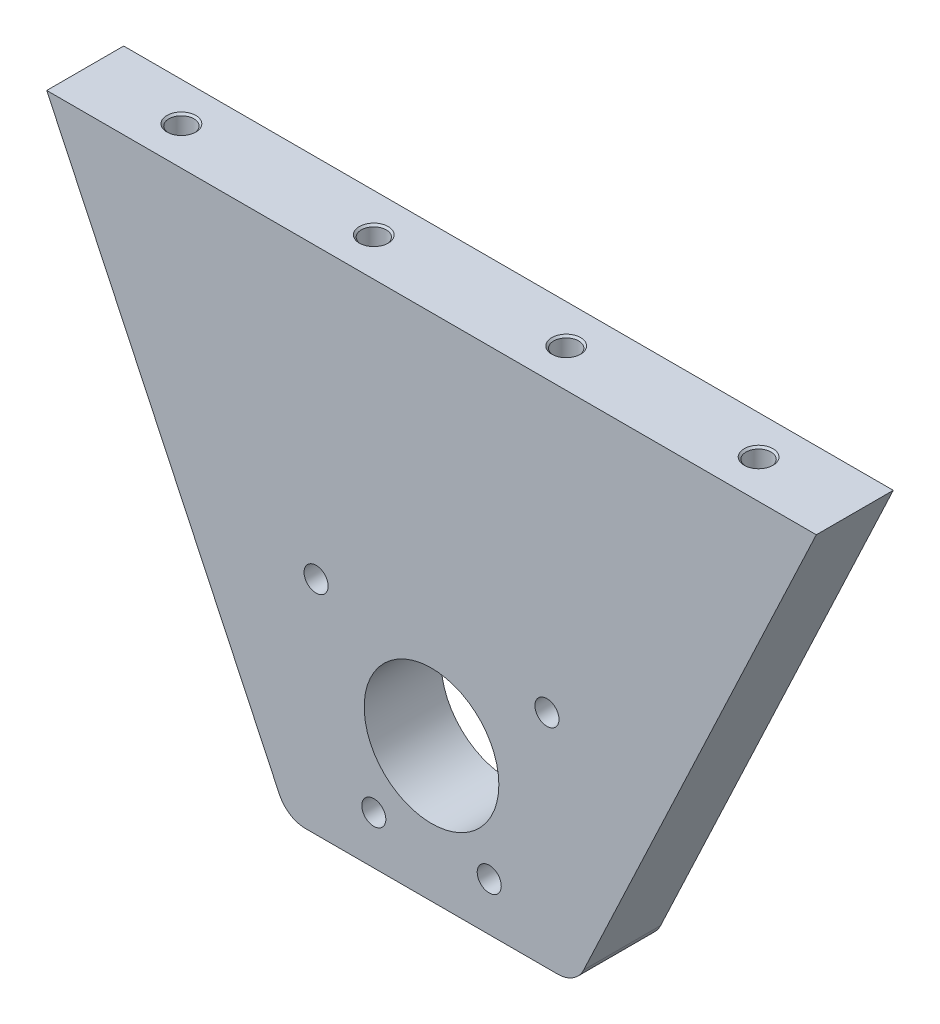
ISO-10303-21;
HEADER;
FILE_DESCRIPTION(('STEP AP214'),'2;1');
FILE_NAME('part.step','',(''),(''),'','','');
FILE_SCHEMA(('AUTOMOTIVE_DESIGN { 1 0 10303 214 1 1 1 1 }'));
ENDSEC;
DATA;
#1=APPLICATION_CONTEXT('core data for automotive mechanical design processes');
#2=APPLICATION_PROTOCOL_DEFINITION('international standard','automotive_design',2000,#1);
#3=PRODUCT_CONTEXT('',#1,'mechanical');
#4=PRODUCT('Part','Part','',(#3));
#5=PRODUCT_RELATED_PRODUCT_CATEGORY('part','',(#4));
#6=PRODUCT_DEFINITION_FORMATION('','',#4);
#7=PRODUCT_DEFINITION_CONTEXT('part definition',#1,'design');
#8=PRODUCT_DEFINITION('design','',#6,#7);
#9=PRODUCT_DEFINITION_SHAPE('','',#8);
#10=(LENGTH_UNIT() NAMED_UNIT(*) SI_UNIT(.MILLI.,.METRE.));
#11=(NAMED_UNIT(*) PLANE_ANGLE_UNIT() SI_UNIT($,.RADIAN.));
#12=(NAMED_UNIT(*) SI_UNIT($,.STERADIAN.) SOLID_ANGLE_UNIT());
#13=UNCERTAINTY_MEASURE_WITH_UNIT(LENGTH_MEASURE(1.E-05),#10,'distance_accuracy_value','');
#14=(GEOMETRIC_REPRESENTATION_CONTEXT(3) GLOBAL_UNCERTAINTY_ASSIGNED_CONTEXT((#13)) GLOBAL_UNIT_ASSIGNED_CONTEXT((#10,
#11,#12)) REPRESENTATION_CONTEXT('',''));
#15=CARTESIAN_POINT('',(0.,0.,0.));
#16=DIRECTION('',(0.,0.,1.));
#17=DIRECTION('',(1.,0.,0.));
#18=AXIS2_PLACEMENT_3D('',#15,#16,#17);
#19=CARTESIAN_POINT('',(0.,48.,8.));
#20=DIRECTION('',(0.,1.,0.));
#21=DIRECTION('',(0.,0.,1.));
#22=AXIS2_PLACEMENT_3D('',#19,#20,#21);
#23=PLANE('',#22);
#24=CARTESIAN_POINT('',(-30.,48.,4.00000000000001));
#25=DIRECTION('',(0.,1.,0.));
#26=DIRECTION('',(0.,0.,1.));
#27=AXIS2_PLACEMENT_3D('',#24,#25,#26);
#28=CIRCLE('',#27,1.5);
#29=CARTESIAN_POINT('',(-30.,48.,5.50000000000001));
#30=VERTEX_POINT('',#29);
#31=EDGE_CURVE('E226',#30,#30,#28,.F.);
#32=ORIENTED_EDGE('',*,*,#31,.T.);
#33=EDGE_LOOP('',(#32));
#34=FACE_BOUND('',#33,.T.);
#35=CARTESIAN_POINT('',(30.,48.,4.));
#36=DIRECTION('',(0.,1.,0.));
#37=DIRECTION('',(0.,0.,1.));
#38=AXIS2_PLACEMENT_3D('',#35,#36,#37);
#39=CIRCLE('',#38,1.5);
#40=CARTESIAN_POINT('',(30.,48.,5.5));
#41=VERTEX_POINT('',#40);
#42=EDGE_CURVE('E222',#41,#41,#39,.F.);
#43=ORIENTED_EDGE('',*,*,#42,.T.);
#44=EDGE_LOOP('',(#43));
#45=FACE_BOUND('',#44,.T.);
#46=CARTESIAN_POINT('',(10.,48.,4.));
#47=DIRECTION('',(0.,1.,0.));
#48=DIRECTION('',(0.,0.,1.));
#49=AXIS2_PLACEMENT_3D('',#46,#47,#48);
#50=CIRCLE('',#49,1.5);
#51=CARTESIAN_POINT('',(10.,48.,5.5));
#52=VERTEX_POINT('',#51);
#53=EDGE_CURVE('E218',#52,#52,#50,.F.);
#54=ORIENTED_EDGE('',*,*,#53,.T.);
#55=EDGE_LOOP('',(#54));
#56=FACE_BOUND('',#55,.T.);
#57=CARTESIAN_POINT('',(-10.,48.,4.));
#58=DIRECTION('',(0.,1.,0.));
#59=DIRECTION('',(0.,0.,1.));
#60=AXIS2_PLACEMENT_3D('',#57,#58,#59);
#61=CIRCLE('',#60,1.5);
#62=CARTESIAN_POINT('',(-10.,48.,5.5));
#63=VERTEX_POINT('',#62);
#64=EDGE_CURVE('E214',#63,#63,#61,.F.);
#65=ORIENTED_EDGE('',*,*,#64,.T.);
#66=EDGE_LOOP('',(#65));
#67=FACE_BOUND('',#66,.T.);
#68=DIRECTION('',(1.,0.,0.));
#69=VECTOR('',#68,1.);
#70=CARTESIAN_POINT('',(0.,48.,0.));
#71=LINE('',#70,#69);
#72=CARTESIAN_POINT('',(-40.,48.,0.));
#73=VERTEX_POINT('',#72);
#74=CARTESIAN_POINT('',(40.,48.,0.));
#75=VERTEX_POINT('',#74);
#76=EDGE_CURVE('E157',#73,#75,#71,.T.);
#77=ORIENTED_EDGE('',*,*,#76,.F.);
#78=DIRECTION('',(0.,0.,-1.));
#79=VECTOR('',#78,1.);
#80=CARTESIAN_POINT('',(-40.,48.,8.));
#81=LINE('',#80,#79);
#82=CARTESIAN_POINT('',(-40.,48.,8.));
#83=VERTEX_POINT('',#82);
#84=EDGE_CURVE('E92',#83,#73,#81,.T.);
#85=ORIENTED_EDGE('',*,*,#84,.F.);
#86=DIRECTION('',(1.,0.,0.));
#87=VECTOR('',#86,1.);
#88=CARTESIAN_POINT('',(0.,48.,8.));
#89=LINE('',#88,#87);
#90=CARTESIAN_POINT('',(40.,48.,8.));
#91=VERTEX_POINT('',#90);
#92=EDGE_CURVE('E198',#83,#91,#89,.T.);
#93=ORIENTED_EDGE('',*,*,#92,.T.);
#94=DIRECTION('',(0.,0.,-1.));
#95=VECTOR('',#94,1.);
#96=CARTESIAN_POINT('',(40.,48.,8.));
#97=LINE('',#96,#95);
#98=EDGE_CURVE('E62',#91,#75,#97,.T.);
#99=ORIENTED_EDGE('',*,*,#98,.T.);
#100=EDGE_LOOP('',(#77,#85,#93,#99));
#101=FACE_BOUND('',#100,.T.);
#102=ADVANCED_FACE('F43',(#34,#45,#56,#67,#101),#23,.T.);
#103=CARTESIAN_POINT('',(-14.1991846243448,-6.69772859638905,8.));
#104=DIRECTION('',(-0.90443159251151,-0.426618675712977,0.));
#105=DIRECTION('',(0.426618675712977,-0.90443159251151,0.));
#106=AXIS2_PLACEMENT_3D('',#103,#104,#105);
#107=PLANE('',#106);
#108=DIRECTION('',(-0.426618675712977,0.90443159251151,0.));
#109=VECTOR('',#108,1.);
#110=CARTESIAN_POINT('',(-14.1991846243448,-6.69772859638905,0.));
#111=LINE('',#110,#109);
#112=CARTESIAN_POINT('',(-15.8113886664439,-3.27985602713894,0.));
#113=VERTEX_POINT('',#112);
#114=EDGE_CURVE('E160',#113,#73,#111,.T.);
#115=ORIENTED_EDGE('',*,*,#114,.F.);
#116=DIRECTION('',(0.,0.,-1.));
#117=VECTOR('',#116,1.);
#118=CARTESIAN_POINT('',(-15.8113886664439,-3.27985602713894,8.));
#119=LINE('',#118,#117);
#120=CARTESIAN_POINT('',(-15.8113886664439,-3.27985602713894,8.));
#121=VERTEX_POINT('',#120);
#122=EDGE_CURVE('E205',#121,#113,#119,.T.);
#123=ORIENTED_EDGE('',*,*,#122,.F.);
#124=DIRECTION('',(-0.426618675712977,0.90443159251151,0.));
#125=VECTOR('',#124,1.);
#126=CARTESIAN_POINT('',(-14.1991846243448,-6.69772859638905,8.));
#127=LINE('',#126,#125);
#128=EDGE_CURVE('E131',#121,#83,#127,.T.);
#129=ORIENTED_EDGE('',*,*,#128,.T.);
#130=ORIENTED_EDGE('',*,*,#84,.T.);
#131=EDGE_LOOP('',(#115,#123,#129,#130));
#132=FACE_BOUND('',#131,.T.);
#133=ADVANCED_FACE('F255',(#132),#107,.T.);
#134=CARTESIAN_POINT('',(-13.0980938889094,-2.,8.));
#135=DIRECTION('',(0.,0.,-1.));
#136=DIRECTION('',(-1.,0.,0.));
#137=AXIS2_PLACEMENT_3D('',#134,#135,#136);
#138=CYLINDRICAL_SURFACE('',#137,3.);
#139=CARTESIAN_POINT('',(-13.0980938889094,-2.,0.));
#140=DIRECTION('',(0.,0.,1.));
#141=DIRECTION('',(1.,0.,0.));
#142=AXIS2_PLACEMENT_3D('',#139,#140,#141);
#143=CIRCLE('',#142,3.);
#144=CARTESIAN_POINT('',(-13.0980938889094,-5.,0.));
#145=VERTEX_POINT('',#144);
#146=EDGE_CURVE('E165',#113,#145,#143,.T.);
#147=ORIENTED_EDGE('',*,*,#146,.T.);
#148=DIRECTION('',(0.,0.,-1.));
#149=VECTOR('',#148,1.);
#150=CARTESIAN_POINT('',(-13.0980938889094,-5.,8.));
#151=LINE('',#150,#149);
#152=CARTESIAN_POINT('',(-13.0980938889094,-5.,8.));
#153=VERTEX_POINT('',#152);
#154=EDGE_CURVE('E113',#153,#145,#151,.T.);
#155=ORIENTED_EDGE('',*,*,#154,.F.);
#156=CARTESIAN_POINT('',(-13.0980938889094,-2.,8.));
#157=DIRECTION('',(0.,0.,1.));
#158=DIRECTION('',(1.,0.,0.));
#159=AXIS2_PLACEMENT_3D('',#156,#157,#158);
#160=CIRCLE('',#159,3.);
#161=EDGE_CURVE('E126',#121,#153,#160,.T.);
#162=ORIENTED_EDGE('',*,*,#161,.F.);
#163=ORIENTED_EDGE('',*,*,#122,.T.);
#164=EDGE_LOOP('',(#147,#155,#162,#163));
#165=FACE_BOUND('',#164,.T.);
#166=ADVANCED_FACE('F261',(#165),#138,.T.);
#167=CARTESIAN_POINT('',(0.,-5.,8.));
#168=DIRECTION('',(0.,-1.,0.));
#169=DIRECTION('',(1.,0.,0.));
#170=AXIS2_PLACEMENT_3D('',#167,#168,#169);
#171=PLANE('',#170);
#172=DIRECTION('',(-1.,0.,0.));
#173=VECTOR('',#172,1.);
#174=CARTESIAN_POINT('',(0.,-5.,0.));
#175=LINE('',#174,#173);
#176=CARTESIAN_POINT('',(13.0980938889094,-5.,0.));
#177=VERTEX_POINT('',#176);
#178=EDGE_CURVE('E109',#177,#145,#175,.T.);
#179=ORIENTED_EDGE('',*,*,#178,.F.);
#180=DIRECTION('',(0.,0.,-1.));
#181=VECTOR('',#180,1.);
#182=CARTESIAN_POINT('',(13.0980938889094,-5.,8.));
#183=LINE('',#182,#181);
#184=CARTESIAN_POINT('',(13.0980938889094,-5.,8.));
#185=VERTEX_POINT('',#184);
#186=EDGE_CURVE('E103',#185,#177,#183,.T.);
#187=ORIENTED_EDGE('',*,*,#186,.F.);
#188=DIRECTION('',(-1.,0.,0.));
#189=VECTOR('',#188,1.);
#190=CARTESIAN_POINT('',(0.,-5.,8.));
#191=LINE('',#190,#189);
#192=EDGE_CURVE('E107',#185,#153,#191,.T.);
#193=ORIENTED_EDGE('',*,*,#192,.T.);
#194=ORIENTED_EDGE('',*,*,#154,.T.);
#195=EDGE_LOOP('',(#179,#187,#193,#194));
#196=FACE_BOUND('',#195,.T.);
#197=ADVANCED_FACE('F105',(#196),#171,.T.);
#198=CARTESIAN_POINT('',(13.0980938889094,-1.99999999999999,8.));
#199=DIRECTION('',(0.,0.,-1.));
#200=DIRECTION('',(-1.,0.,0.));
#201=AXIS2_PLACEMENT_3D('',#198,#199,#200);
#202=CYLINDRICAL_SURFACE('',#201,3.);
#203=CARTESIAN_POINT('',(13.0980938889094,-1.99999999999999,0.));
#204=DIRECTION('',(0.,0.,1.));
#205=DIRECTION('',(1.,0.,0.));
#206=AXIS2_PLACEMENT_3D('',#203,#204,#205);
#207=CIRCLE('',#206,3.);
#208=CARTESIAN_POINT('',(15.8113886664439,-3.27985602713892,0.));
#209=VERTEX_POINT('',#208);
#210=EDGE_CURVE('E171',#177,#209,#207,.T.);
#211=ORIENTED_EDGE('',*,*,#210,.T.);
#212=DIRECTION('',(0.,0.,-1.));
#213=VECTOR('',#212,1.);
#214=CARTESIAN_POINT('',(15.8113886664439,-3.27985602713892,8.));
#215=LINE('',#214,#213);
#216=CARTESIAN_POINT('',(15.8113886664439,-3.27985602713892,8.));
#217=VERTEX_POINT('',#216);
#218=EDGE_CURVE('E83',#217,#209,#215,.T.);
#219=ORIENTED_EDGE('',*,*,#218,.F.);
#220=CARTESIAN_POINT('',(13.0980938889094,-1.99999999999999,8.));
#221=DIRECTION('',(0.,0.,1.));
#222=DIRECTION('',(1.,0.,0.));
#223=AXIS2_PLACEMENT_3D('',#220,#221,#222);
#224=CIRCLE('',#223,3.);
#225=EDGE_CURVE('E115',#185,#217,#224,.T.);
#226=ORIENTED_EDGE('',*,*,#225,.F.);
#227=ORIENTED_EDGE('',*,*,#186,.T.);
#228=EDGE_LOOP('',(#211,#219,#226,#227));
#229=FACE_BOUND('',#228,.T.);
#230=ADVANCED_FACE('F116',(#229),#202,.T.);
#231=CARTESIAN_POINT('',(-12.,18.,8.));
#232=DIRECTION('',(0.,0.,-1.));
#233=DIRECTION('',(-1.,0.,0.));
#234=AXIS2_PLACEMENT_3D('',#231,#232,#233);
#235=CYLINDRICAL_SURFACE('',#234,1.25);
#236=CARTESIAN_POINT('',(-12.,18.,8.));
#237=DIRECTION('',(0.,0.,1.));
#238=DIRECTION('',(1.,0.,0.));
#239=AXIS2_PLACEMENT_3D('',#236,#237,#238);
#240=CIRCLE('',#239,1.25);
#241=CARTESIAN_POINT('',(-10.75,18.,8.));
#242=VERTEX_POINT('',#241);
#243=EDGE_CURVE('E149',#242,#242,#240,.T.);
#244=ORIENTED_EDGE('',*,*,#243,.T.);
#245=EDGE_LOOP('',(#244));
#246=FACE_BOUND('',#245,.T.);
#247=CARTESIAN_POINT('',(-12.,18.,0.));
#248=DIRECTION('',(0.,0.,1.));
#249=DIRECTION('',(1.,0.,0.));
#250=AXIS2_PLACEMENT_3D('',#247,#248,#249);
#251=CIRCLE('',#250,1.25);
#252=CARTESIAN_POINT('',(-10.75,18.,0.));
#253=VERTEX_POINT('',#252);
#254=EDGE_CURVE('E190',#253,#253,#251,.T.);
#255=ORIENTED_EDGE('',*,*,#254,.F.);
#256=EDGE_LOOP('',(#255));
#257=FACE_BOUND('',#256,.T.);
#258=ADVANCED_FACE('F331',(#246,#257),#235,.F.);
#259=CARTESIAN_POINT('',(-6.,0.,8.));
#260=DIRECTION('',(0.,0.,-1.));
#261=DIRECTION('',(-1.,0.,0.));
#262=AXIS2_PLACEMENT_3D('',#259,#260,#261);
#263=CYLINDRICAL_SURFACE('',#262,1.25);
#264=CARTESIAN_POINT('',(-6.,0.,8.));
#265=DIRECTION('',(0.,0.,1.));
#266=DIRECTION('',(1.,0.,0.));
#267=AXIS2_PLACEMENT_3D('',#264,#265,#266);
#268=CIRCLE('',#267,1.25);
#269=CARTESIAN_POINT('',(-4.75,0.,8.));
#270=VERTEX_POINT('',#269);
#271=EDGE_CURVE('E145',#270,#270,#268,.T.);
#272=ORIENTED_EDGE('',*,*,#271,.T.);
#273=EDGE_LOOP('',(#272));
#274=FACE_BOUND('',#273,.T.);
#275=CARTESIAN_POINT('',(-6.,0.,0.));
#276=DIRECTION('',(0.,0.,1.));
#277=DIRECTION('',(1.,0.,0.));
#278=AXIS2_PLACEMENT_3D('',#275,#276,#277);
#279=CIRCLE('',#278,1.25);
#280=CARTESIAN_POINT('',(-4.75,0.,0.));
#281=VERTEX_POINT('',#280);
#282=EDGE_CURVE('E186',#281,#281,#279,.T.);
#283=ORIENTED_EDGE('',*,*,#282,.F.);
#284=EDGE_LOOP('',(#283));
#285=FACE_BOUND('',#284,.T.);
#286=ADVANCED_FACE('F343',(#274,#285),#263,.F.);
#287=CARTESIAN_POINT('',(6.,0.,8.));
#288=DIRECTION('',(0.,0.,-1.));
#289=DIRECTION('',(-1.,0.,0.));
#290=AXIS2_PLACEMENT_3D('',#287,#288,#289);
#291=CYLINDRICAL_SURFACE('',#290,1.25);
#292=CARTESIAN_POINT('',(6.,0.,8.));
#293=DIRECTION('',(0.,0.,1.));
#294=DIRECTION('',(1.,0.,0.));
#295=AXIS2_PLACEMENT_3D('',#292,#293,#294);
#296=CIRCLE('',#295,1.25);
#297=CARTESIAN_POINT('',(7.25,0.,8.));
#298=VERTEX_POINT('',#297);
#299=EDGE_CURVE('E141',#298,#298,#296,.T.);
#300=ORIENTED_EDGE('',*,*,#299,.T.);
#301=EDGE_LOOP('',(#300));
#302=FACE_BOUND('',#301,.T.);
#303=CARTESIAN_POINT('',(6.,0.,0.));
#304=DIRECTION('',(0.,0.,1.));
#305=DIRECTION('',(1.,0.,0.));
#306=AXIS2_PLACEMENT_3D('',#303,#304,#305);
#307=CIRCLE('',#306,1.25);
#308=CARTESIAN_POINT('',(7.25,0.,0.));
#309=VERTEX_POINT('',#308);
#310=EDGE_CURVE('E182',#309,#309,#307,.T.);
#311=ORIENTED_EDGE('',*,*,#310,.F.);
#312=EDGE_LOOP('',(#311));
#313=FACE_BOUND('',#312,.T.);
#314=ADVANCED_FACE('F339',(#302,#313),#291,.F.);
#315=CARTESIAN_POINT('',(0.,9.,8.));
#316=DIRECTION('',(0.,0.,-1.));
#317=DIRECTION('',(-1.,0.,0.));
#318=AXIS2_PLACEMENT_3D('',#315,#316,#317);
#319=CYLINDRICAL_SURFACE('',#318,7.);
#320=CARTESIAN_POINT('',(0.,9.,8.));
#321=DIRECTION('',(0.,0.,1.));
#322=DIRECTION('',(1.,0.,0.));
#323=AXIS2_PLACEMENT_3D('',#320,#321,#322);
#324=CIRCLE('',#323,7.);
#325=CARTESIAN_POINT('',(7.,9.,8.));
#326=VERTEX_POINT('',#325);
#327=EDGE_CURVE('E137',#326,#326,#324,.T.);
#328=ORIENTED_EDGE('',*,*,#327,.T.);
#329=EDGE_LOOP('',(#328));
#330=FACE_BOUND('',#329,.T.);
#331=CARTESIAN_POINT('',(0.,9.,0.));
#332=DIRECTION('',(0.,0.,1.));
#333=DIRECTION('',(1.,0.,0.));
#334=AXIS2_PLACEMENT_3D('',#331,#332,#333);
#335=CIRCLE('',#334,7.);
#336=CARTESIAN_POINT('',(7.,9.,0.));
#337=VERTEX_POINT('',#336);
#338=EDGE_CURVE('E178',#337,#337,#335,.T.);
#339=ORIENTED_EDGE('',*,*,#338,.F.);
#340=EDGE_LOOP('',(#339));
#341=FACE_BOUND('',#340,.T.);
#342=ADVANCED_FACE('F336',(#330,#341),#319,.F.);
#343=CARTESIAN_POINT('',(14.1991846243448,-6.69772859638905,8.));
#344=DIRECTION('',(0.90443159251151,-0.426618675712977,0.));
#345=DIRECTION('',(0.426618675712977,0.90443159251151,0.));
#346=AXIS2_PLACEMENT_3D('',#343,#344,#345);
#347=PLANE('',#346);
#348=DIRECTION('',(-0.426618675712977,-0.90443159251151,0.));
#349=VECTOR('',#348,1.);
#350=CARTESIAN_POINT('',(14.1991846243448,-6.69772859638905,0.));
#351=LINE('',#350,#349);
#352=EDGE_CURVE('E174',#75,#209,#351,.T.);
#353=ORIENTED_EDGE('',*,*,#352,.F.);
#354=ORIENTED_EDGE('',*,*,#98,.F.);
#355=DIRECTION('',(-0.426618675712977,-0.90443159251151,0.));
#356=VECTOR('',#355,1.);
#357=CARTESIAN_POINT('',(14.1991846243448,-6.69772859638905,8.));
#358=LINE('',#357,#356);
#359=EDGE_CURVE('E120',#91,#217,#358,.T.);
#360=ORIENTED_EDGE('',*,*,#359,.T.);
#361=ORIENTED_EDGE('',*,*,#218,.T.);
#362=EDGE_LOOP('',(#353,#354,#360,#361));
#363=FACE_BOUND('',#362,.T.);
#364=ADVANCED_FACE('F332',(#363),#347,.T.);
#365=CARTESIAN_POINT('',(12.,18.,8.));
#366=DIRECTION('',(0.,0.,-1.));
#367=DIRECTION('',(-1.,0.,0.));
#368=AXIS2_PLACEMENT_3D('',#365,#366,#367);
#369=CYLINDRICAL_SURFACE('',#368,1.25);
#370=CARTESIAN_POINT('',(12.,18.,8.));
#371=DIRECTION('',(0.,0.,1.));
#372=DIRECTION('',(1.,0.,0.));
#373=AXIS2_PLACEMENT_3D('',#370,#371,#372);
#374=CIRCLE('',#373,1.25);
#375=CARTESIAN_POINT('',(13.25,18.,8.));
#376=VERTEX_POINT('',#375);
#377=EDGE_CURVE('E153',#376,#376,#374,.T.);
#378=ORIENTED_EDGE('',*,*,#377,.T.);
#379=EDGE_LOOP('',(#378));
#380=FACE_BOUND('',#379,.T.);
#381=CARTESIAN_POINT('',(12.,18.,0.));
#382=DIRECTION('',(0.,0.,1.));
#383=DIRECTION('',(1.,0.,0.));
#384=AXIS2_PLACEMENT_3D('',#381,#382,#383);
#385=CIRCLE('',#384,1.25);
#386=CARTESIAN_POINT('',(13.25,18.,0.));
#387=VERTEX_POINT('',#386);
#388=EDGE_CURVE('E194',#387,#387,#385,.T.);
#389=ORIENTED_EDGE('',*,*,#388,.F.);
#390=EDGE_LOOP('',(#389));
#391=FACE_BOUND('',#390,.T.);
#392=ADVANCED_FACE('F335',(#380,#391),#369,.F.);
#393=CARTESIAN_POINT('',(0.,0.,8.));
#394=DIRECTION('',(0.,0.,1.));
#395=DIRECTION('',(1.,0.,0.));
#396=AXIS2_PLACEMENT_3D('',#393,#394,#395);
#397=PLANE('',#396);
#398=ORIENTED_EDGE('',*,*,#92,.F.);
#399=ORIENTED_EDGE('',*,*,#128,.F.);
#400=ORIENTED_EDGE('',*,*,#161,.T.);
#401=ORIENTED_EDGE('',*,*,#192,.F.);
#402=ORIENTED_EDGE('',*,*,#225,.T.);
#403=ORIENTED_EDGE('',*,*,#359,.F.);
#404=EDGE_LOOP('',(#398,#399,#400,#401,#402,#403));
#405=FACE_BOUND('',#404,.T.);
#406=ORIENTED_EDGE('',*,*,#327,.F.);
#407=EDGE_LOOP('',(#406));
#408=FACE_BOUND('',#407,.T.);
#409=ORIENTED_EDGE('',*,*,#299,.F.);
#410=EDGE_LOOP('',(#409));
#411=FACE_BOUND('',#410,.T.);
#412=ORIENTED_EDGE('',*,*,#271,.F.);
#413=EDGE_LOOP('',(#412));
#414=FACE_BOUND('',#413,.T.);
#415=ORIENTED_EDGE('',*,*,#243,.F.);
#416=EDGE_LOOP('',(#415));
#417=FACE_BOUND('',#416,.T.);
#418=ORIENTED_EDGE('',*,*,#377,.F.);
#419=EDGE_LOOP('',(#418));
#420=FACE_BOUND('',#419,.T.);
#421=ADVANCED_FACE('F122',(#405,#408,#411,#414,#417,#420),#397,.T.);
#422=CARTESIAN_POINT('',(0.,0.,0.));
#423=DIRECTION('',(0.,0.,1.));
#424=DIRECTION('',(1.,0.,0.));
#425=AXIS2_PLACEMENT_3D('',#422,#423,#424);
#426=PLANE('',#425);
#427=ORIENTED_EDGE('',*,*,#76,.T.);
#428=ORIENTED_EDGE('',*,*,#352,.T.);
#429=ORIENTED_EDGE('',*,*,#210,.F.);
#430=ORIENTED_EDGE('',*,*,#178,.T.);
#431=ORIENTED_EDGE('',*,*,#146,.F.);
#432=ORIENTED_EDGE('',*,*,#114,.T.);
#433=EDGE_LOOP('',(#427,#428,#429,#430,#431,#432));
#434=FACE_BOUND('',#433,.T.);
#435=ORIENTED_EDGE('',*,*,#338,.T.);
#436=EDGE_LOOP('',(#435));
#437=FACE_BOUND('',#436,.T.);
#438=ORIENTED_EDGE('',*,*,#310,.T.);
#439=EDGE_LOOP('',(#438));
#440=FACE_BOUND('',#439,.T.);
#441=ORIENTED_EDGE('',*,*,#282,.T.);
#442=EDGE_LOOP('',(#441));
#443=FACE_BOUND('',#442,.T.);
#444=ORIENTED_EDGE('',*,*,#254,.T.);
#445=EDGE_LOOP('',(#444));
#446=FACE_BOUND('',#445,.T.);
#447=ORIENTED_EDGE('',*,*,#388,.T.);
#448=EDGE_LOOP('',(#447));
#449=FACE_BOUND('',#448,.T.);
#450=ADVANCED_FACE('F320',(#434,#437,#440,#443,#446,#449),#426,.F.);
#451=CARTESIAN_POINT('',(-10.,40.5,4.));
#452=DIRECTION('',(0.,1.,0.));
#453=DIRECTION('',(0.,0.,1.));
#454=AXIS2_PLACEMENT_3D('',#451,#452,#453);
#455=CYLINDRICAL_SURFACE('',#454,1.3);
#456=CARTESIAN_POINT('',(-10.,47.8,4.));
#457=DIRECTION('',(0.,1.,0.));
#458=DIRECTION('',(0.,0.,1.));
#459=AXIS2_PLACEMENT_3D('',#456,#457,#458);
#460=CIRCLE('',#459,1.3);
#461=CARTESIAN_POINT('',(-10.,47.8,5.3));
#462=VERTEX_POINT('',#461);
#463=EDGE_CURVE('E11',#462,#462,#460,.T.);
#464=ORIENTED_EDGE('',*,*,#463,.T.);
#465=EDGE_LOOP('',(#464));
#466=FACE_BOUND('',#465,.T.);
#467=CARTESIAN_POINT('',(-10.,40.5,4.));
#468=DIRECTION('',(0.,1.,0.));
#469=DIRECTION('',(0.,0.,1.));
#470=AXIS2_PLACEMENT_3D('',#467,#468,#469);
#471=CIRCLE('',#470,1.3);
#472=CARTESIAN_POINT('',(-10.,40.5,5.3));
#473=VERTEX_POINT('',#472);
#474=EDGE_CURVE('E161',#473,#473,#471,.T.);
#475=ORIENTED_EDGE('',*,*,#474,.F.);
#476=EDGE_LOOP('',(#475));
#477=FACE_BOUND('',#476,.T.);
#478=ADVANCED_FACE('F356',(#466,#477),#455,.F.);
#479=CARTESIAN_POINT('',(-10.,40.5,4.));
#480=DIRECTION('',(0.,1.,0.));
#481=DIRECTION('',(0.,0.,1.));
#482=AXIS2_PLACEMENT_3D('',#479,#480,#481);
#483=PLANE('',#482);
#484=ORIENTED_EDGE('',*,*,#474,.T.);
#485=EDGE_LOOP('',(#484));
#486=FACE_BOUND('',#485,.T.);
#487=ADVANCED_FACE('F294',(#486),#483,.T.);
#488=CARTESIAN_POINT('',(-30.,40.5,4.00000000000001));
#489=DIRECTION('',(0.,1.,0.));
#490=DIRECTION('',(0.,0.,1.));
#491=AXIS2_PLACEMENT_3D('',#488,#489,#490);
#492=CYLINDRICAL_SURFACE('',#491,1.3);
#493=CARTESIAN_POINT('',(-30.,47.8,4.00000000000001));
#494=DIRECTION('',(0.,1.,0.));
#495=DIRECTION('',(0.,0.,1.));
#496=AXIS2_PLACEMENT_3D('',#493,#494,#495);
#497=CIRCLE('',#496,1.3);
#498=CARTESIAN_POINT('',(-30.,47.8,5.3));
#499=VERTEX_POINT('',#498);
#500=EDGE_CURVE('E210',#499,#499,#497,.T.);
#501=ORIENTED_EDGE('',*,*,#500,.T.);
#502=EDGE_LOOP('',(#501));
#503=FACE_BOUND('',#502,.T.);
#504=CARTESIAN_POINT('',(-30.,40.5,4.00000000000001));
#505=DIRECTION('',(0.,1.,0.));
#506=DIRECTION('',(0.,0.,1.));
#507=AXIS2_PLACEMENT_3D('',#504,#505,#506);
#508=CIRCLE('',#507,1.3);
#509=CARTESIAN_POINT('',(-30.,40.5,5.3));
#510=VERTEX_POINT('',#509);
#511=EDGE_CURVE('E298',#510,#510,#508,.T.);
#512=ORIENTED_EDGE('',*,*,#511,.F.);
#513=EDGE_LOOP('',(#512));
#514=FACE_BOUND('',#513,.T.);
#515=ADVANCED_FACE('F290',(#503,#514),#492,.F.);
#516=CARTESIAN_POINT('',(-30.,40.5,4.00000000000001));
#517=DIRECTION('',(0.,1.,0.));
#518=DIRECTION('',(0.,0.,1.));
#519=AXIS2_PLACEMENT_3D('',#516,#517,#518);
#520=PLANE('',#519);
#521=ORIENTED_EDGE('',*,*,#511,.T.);
#522=EDGE_LOOP('',(#521));
#523=FACE_BOUND('',#522,.T.);
#524=ADVANCED_FACE('F293',(#523),#520,.T.);
#525=CARTESIAN_POINT('',(10.,40.5,4.));
#526=DIRECTION('',(0.,1.,0.));
#527=DIRECTION('',(0.,0.,1.));
#528=AXIS2_PLACEMENT_3D('',#525,#526,#527);
#529=CYLINDRICAL_SURFACE('',#528,1.3);
#530=CARTESIAN_POINT('',(10.,47.8,4.));
#531=DIRECTION('',(0.,1.,0.));
#532=DIRECTION('',(0.,0.,1.));
#533=AXIS2_PLACEMENT_3D('',#530,#531,#532);
#534=CIRCLE('',#533,1.3);
#535=CARTESIAN_POINT('',(10.,47.8,5.3));
#536=VERTEX_POINT('',#535);
#537=EDGE_CURVE('E54',#536,#536,#534,.T.);
#538=ORIENTED_EDGE('',*,*,#537,.T.);
#539=EDGE_LOOP('',(#538));
#540=FACE_BOUND('',#539,.T.);
#541=CARTESIAN_POINT('',(10.,40.5,4.));
#542=DIRECTION('',(0.,1.,0.));
#543=DIRECTION('',(0.,0.,1.));
#544=AXIS2_PLACEMENT_3D('',#541,#542,#543);
#545=CIRCLE('',#544,1.3);
#546=CARTESIAN_POINT('',(10.,40.5,5.3));
#547=VERTEX_POINT('',#546);
#548=EDGE_CURVE('E301',#547,#547,#545,.T.);
#549=ORIENTED_EDGE('',*,*,#548,.F.);
#550=EDGE_LOOP('',(#549));
#551=FACE_BOUND('',#550,.T.);
#552=ADVANCED_FACE('F237',(#540,#551),#529,.F.);
#553=CARTESIAN_POINT('',(10.,40.5,4.));
#554=DIRECTION('',(0.,1.,0.));
#555=DIRECTION('',(0.,0.,1.));
#556=AXIS2_PLACEMENT_3D('',#553,#554,#555);
#557=PLANE('',#556);
#558=ORIENTED_EDGE('',*,*,#548,.T.);
#559=EDGE_LOOP('',(#558));
#560=FACE_BOUND('',#559,.T.);
#561=ADVANCED_FACE('F366',(#560),#557,.T.);
#562=CARTESIAN_POINT('',(30.,40.5,4.));
#563=DIRECTION('',(0.,1.,0.));
#564=DIRECTION('',(0.,0.,1.));
#565=AXIS2_PLACEMENT_3D('',#562,#563,#564);
#566=CYLINDRICAL_SURFACE('',#565,1.3);
#567=CARTESIAN_POINT('',(30.,47.8,4.));
#568=DIRECTION('',(0.,1.,0.));
#569=DIRECTION('',(0.,0.,1.));
#570=AXIS2_PLACEMENT_3D('',#567,#568,#569);
#571=CIRCLE('',#570,1.3);
#572=CARTESIAN_POINT('',(30.,47.8,5.3));
#573=VERTEX_POINT('',#572);
#574=EDGE_CURVE('E230',#573,#573,#571,.T.);
#575=ORIENTED_EDGE('',*,*,#574,.T.);
#576=EDGE_LOOP('',(#575));
#577=FACE_BOUND('',#576,.T.);
#578=CARTESIAN_POINT('',(30.,40.5,4.));
#579=DIRECTION('',(0.,1.,0.));
#580=DIRECTION('',(0.,0.,1.));
#581=AXIS2_PLACEMENT_3D('',#578,#579,#580);
#582=CIRCLE('',#581,1.3);
#583=CARTESIAN_POINT('',(30.,40.5,5.3));
#584=VERTEX_POINT('',#583);
#585=EDGE_CURVE('E308',#584,#584,#582,.T.);
#586=ORIENTED_EDGE('',*,*,#585,.F.);
#587=EDGE_LOOP('',(#586));
#588=FACE_BOUND('',#587,.T.);
#589=ADVANCED_FACE('F283',(#577,#588),#566,.F.);
#590=CARTESIAN_POINT('',(30.,40.5,4.));
#591=DIRECTION('',(0.,1.,0.));
#592=DIRECTION('',(0.,0.,1.));
#593=AXIS2_PLACEMENT_3D('',#590,#591,#592);
#594=PLANE('',#593);
#595=ORIENTED_EDGE('',*,*,#585,.T.);
#596=EDGE_LOOP('',(#595));
#597=FACE_BOUND('',#596,.T.);
#598=ADVANCED_FACE('F272',(#597),#594,.T.);
#599=CARTESIAN_POINT('',(-30.,47.8,4.00000000000001));
#600=DIRECTION('',(0.,1.,0.));
#601=DIRECTION('',(0.,0.,1.));
#602=AXIS2_PLACEMENT_3D('',#599,#600,#601);
#603=CONICAL_SURFACE('',#602,1.3,0.785398163397442);
#604=ORIENTED_EDGE('',*,*,#31,.F.);
#605=EDGE_LOOP('',(#604));
#606=FACE_BOUND('',#605,.T.);
#607=ORIENTED_EDGE('',*,*,#500,.F.);
#608=EDGE_LOOP('',(#607));
#609=FACE_BOUND('',#608,.T.);
#610=ADVANCED_FACE('F249',(#606,#609),#603,.F.);
#611=CARTESIAN_POINT('',(30.,47.8,4.));
#612=DIRECTION('',(0.,1.,0.));
#613=DIRECTION('',(0.,0.,1.));
#614=AXIS2_PLACEMENT_3D('',#611,#612,#613);
#615=CONICAL_SURFACE('',#614,1.3,0.785398163397433);
#616=ORIENTED_EDGE('',*,*,#42,.F.);
#617=EDGE_LOOP('',(#616));
#618=FACE_BOUND('',#617,.T.);
#619=ORIENTED_EDGE('',*,*,#574,.F.);
#620=EDGE_LOOP('',(#619));
#621=FACE_BOUND('',#620,.T.);
#622=ADVANCED_FACE('F242',(#618,#621),#615,.F.);
#623=CARTESIAN_POINT('',(10.,47.8,4.));
#624=DIRECTION('',(0.,1.,0.));
#625=DIRECTION('',(0.,0.,1.));
#626=AXIS2_PLACEMENT_3D('',#623,#624,#625);
#627=CONICAL_SURFACE('',#626,1.3,0.785398163397438);
#628=ORIENTED_EDGE('',*,*,#53,.F.);
#629=EDGE_LOOP('',(#628));
#630=FACE_BOUND('',#629,.T.);
#631=ORIENTED_EDGE('',*,*,#537,.F.);
#632=EDGE_LOOP('',(#631));
#633=FACE_BOUND('',#632,.T.);
#634=ADVANCED_FACE('F240',(#630,#633),#627,.F.);
#635=CARTESIAN_POINT('',(-10.,47.8,4.));
#636=DIRECTION('',(0.,1.,0.));
#637=DIRECTION('',(0.,0.,1.));
#638=AXIS2_PLACEMENT_3D('',#635,#636,#637);
#639=CONICAL_SURFACE('',#638,1.3,0.785398163397438);
#640=ORIENTED_EDGE('',*,*,#64,.F.);
#641=EDGE_LOOP('',(#640));
#642=FACE_BOUND('',#641,.T.);
#643=ORIENTED_EDGE('',*,*,#463,.F.);
#644=EDGE_LOOP('',(#643));
#645=FACE_BOUND('',#644,.T.);
#646=ADVANCED_FACE('F46',(#642,#645),#639,.F.);
#647=CLOSED_SHELL('',(#102,#133,#166,#197,#230,#258,#286,#314,#342,#364,#392,#421,#450,#478,
#487,#515,#524,#552,#561,#589,#598,#610,#622,#634,#646));
#648=MANIFOLD_SOLID_BREP('B2',#647);
#649=ADVANCED_BREP_SHAPE_REPRESENTATION('',(#18,#648),#14);
#650=SHAPE_DEFINITION_REPRESENTATION(#9,#649);
ENDSEC;
END-ISO-10303-21;
